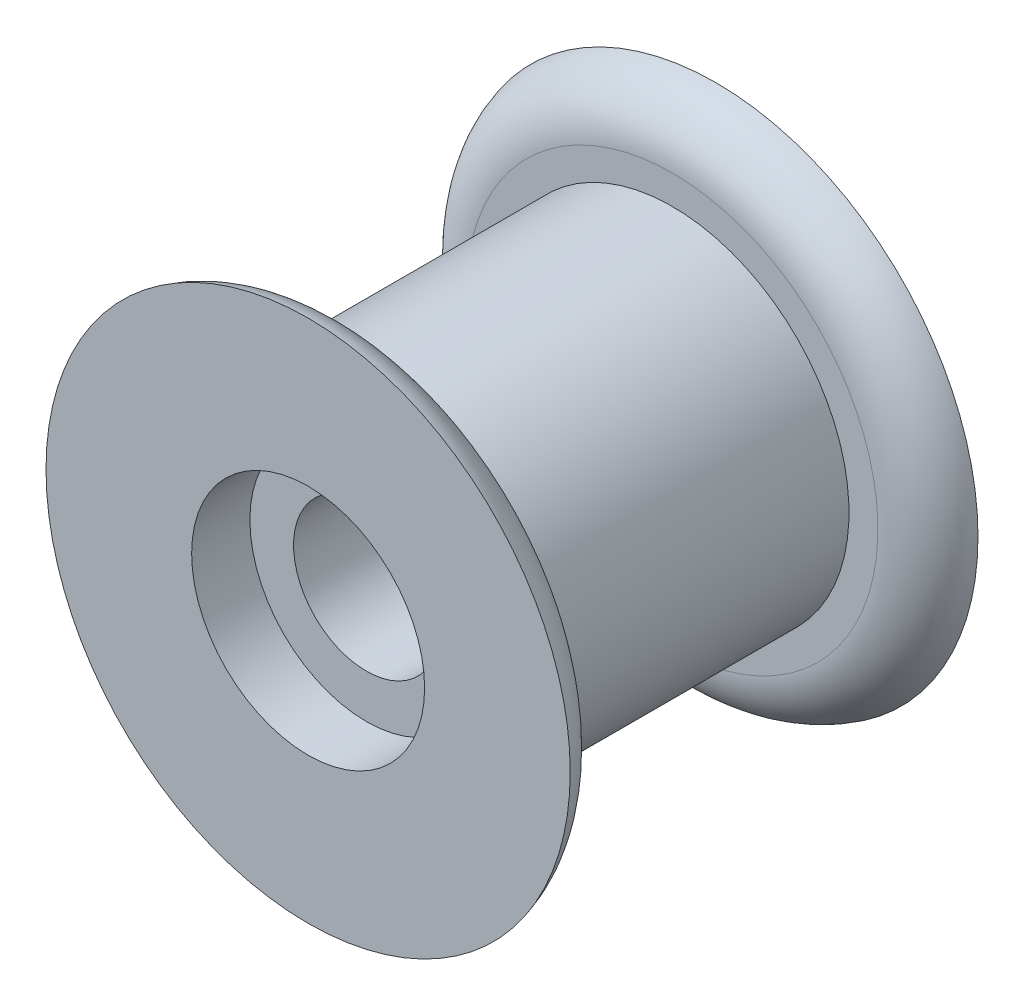
ISO-10303-21;
HEADER;
FILE_DESCRIPTION(('STEP AP214'),'2;1');
FILE_NAME('part.step','',(''),(''),'','','');
FILE_SCHEMA(('AUTOMOTIVE_DESIGN { 1 0 10303 214 1 1 1 1 }'));
ENDSEC;
DATA;
#1=APPLICATION_CONTEXT('core data for automotive mechanical design processes');
#2=APPLICATION_PROTOCOL_DEFINITION('international standard','automotive_design',2000,#1);
#3=PRODUCT_CONTEXT('',#1,'mechanical');
#4=PRODUCT('Part','Part','',(#3));
#5=PRODUCT_RELATED_PRODUCT_CATEGORY('part','',(#4));
#6=PRODUCT_DEFINITION_FORMATION('','',#4);
#7=PRODUCT_DEFINITION_CONTEXT('part definition',#1,'design');
#8=PRODUCT_DEFINITION('design','',#6,#7);
#9=PRODUCT_DEFINITION_SHAPE('','',#8);
#10=(LENGTH_UNIT() NAMED_UNIT(*) SI_UNIT(.MILLI.,.METRE.));
#11=(NAMED_UNIT(*) PLANE_ANGLE_UNIT() SI_UNIT($,.RADIAN.));
#12=(NAMED_UNIT(*) SI_UNIT($,.STERADIAN.) SOLID_ANGLE_UNIT());
#13=UNCERTAINTY_MEASURE_WITH_UNIT(LENGTH_MEASURE(1.E-05),#10,'distance_accuracy_value','');
#14=(GEOMETRIC_REPRESENTATION_CONTEXT(3) GLOBAL_UNCERTAINTY_ASSIGNED_CONTEXT((#13)) GLOBAL_UNIT_ASSIGNED_CONTEXT((#10,
#11,#12)) REPRESENTATION_CONTEXT('',''));
#15=CARTESIAN_POINT('',(0.,0.,0.));
#16=DIRECTION('',(0.,0.,1.));
#17=DIRECTION('',(1.,0.,0.));
#18=AXIS2_PLACEMENT_3D('',#15,#16,#17);
#19=CARTESIAN_POINT('',(0.,0.,0.));
#20=DIRECTION('',(0.,0.,1.));
#21=DIRECTION('',(1.,0.,0.));
#22=AXIS2_PLACEMENT_3D('',#19,#20,#21);
#23=PLANE('',#22);
#24=CARTESIAN_POINT('',(0.,0.,0.));
#25=DIRECTION('',(0.,0.,-1.));
#26=DIRECTION('',(-1.,0.,0.));
#27=AXIS2_PLACEMENT_3D('',#24,#25,#26);
#28=CIRCLE('',#27,4.);
#29=CARTESIAN_POINT('',(-4.,0.,0.));
#30=VERTEX_POINT('',#29);
#31=EDGE_CURVE('E60',#30,#30,#28,.T.);
#32=ORIENTED_EDGE('',*,*,#31,.F.);
#33=EDGE_LOOP('',(#32));
#34=FACE_BOUND('',#33,.T.);
#35=CARTESIAN_POINT('',(0.,0.,0.));
#36=DIRECTION('',(0.,0.,-1.));
#37=DIRECTION('',(-1.,0.,0.));
#38=AXIS2_PLACEMENT_3D('',#35,#36,#37);
#39=CIRCLE('',#38,9.);
#40=CARTESIAN_POINT('',(-9.,0.,0.));
#41=VERTEX_POINT('',#40);
#42=EDGE_CURVE('E44',#41,#41,#39,.T.);
#43=ORIENTED_EDGE('',*,*,#42,.T.);
#44=EDGE_LOOP('',(#43));
#45=FACE_BOUND('',#44,.T.);
#46=ADVANCED_FACE('F33',(#34,#45),#23,.F.);
#47=CARTESIAN_POINT('',(9.,0.,1.5));
#48=DIRECTION('',(0.,0.,-1.));
#49=DIRECTION('',(-1.,0.,0.));
#50=AXIS2_PLACEMENT_3D('',#47,#48,#49);
#51=PLANE('',#50);
#52=CARTESIAN_POINT('',(0.,0.,1.5));
#53=DIRECTION('',(0.,0.,-1.));
#54=DIRECTION('',(-1.,0.,0.));
#55=AXIS2_PLACEMENT_3D('',#52,#53,#54);
#56=CIRCLE('',#55,7.06350832689629);
#57=CARTESIAN_POINT('',(-7.06350832689629,0.,1.5));
#58=VERTEX_POINT('',#57);
#59=EDGE_CURVE('E10',#58,#58,#56,.F.);
#60=ORIENTED_EDGE('',*,*,#59,.T.);
#61=EDGE_LOOP('',(#60));
#62=FACE_BOUND('',#61,.T.);
#63=CARTESIAN_POINT('',(0.,0.,1.5));
#64=DIRECTION('',(0.,0.,-1.));
#65=DIRECTION('',(-1.,0.,0.));
#66=AXIS2_PLACEMENT_3D('',#63,#64,#65);
#67=CIRCLE('',#66,6.07);
#68=CARTESIAN_POINT('',(-6.07,0.,1.5));
#69=VERTEX_POINT('',#68);
#70=EDGE_CURVE('E48',#69,#69,#67,.T.);
#71=ORIENTED_EDGE('',*,*,#70,.T.);
#72=EDGE_LOOP('',(#71));
#73=FACE_BOUND('',#72,.T.);
#74=ADVANCED_FACE('F111',(#62,#73),#51,.F.);
#75=CARTESIAN_POINT('',(0.,0.,-9.94117647058824));
#76=DIRECTION('',(0.,0.,-1.));
#77=DIRECTION('',(-1.,0.,0.));
#78=AXIS2_PLACEMENT_3D('',#75,#76,#77);
#79=CYLINDRICAL_SURFACE('',#78,6.07);
#80=ORIENTED_EDGE('',*,*,#70,.F.);
#81=EDGE_LOOP('',(#80));
#82=FACE_BOUND('',#81,.T.);
#83=CARTESIAN_POINT('',(0.,0.,12.5));
#84=DIRECTION('',(0.,0.,-1.));
#85=DIRECTION('',(-1.,0.,0.));
#86=AXIS2_PLACEMENT_3D('',#83,#84,#85);
#87=CIRCLE('',#86,6.07);
#88=CARTESIAN_POINT('',(-6.07,0.,12.5));
#89=VERTEX_POINT('',#88);
#90=EDGE_CURVE('E53',#89,#89,#87,.T.);
#91=ORIENTED_EDGE('',*,*,#90,.T.);
#92=EDGE_LOOP('',(#91));
#93=FACE_BOUND('',#92,.T.);
#94=ADVANCED_FACE('F116',(#82,#93),#79,.T.);
#95=CARTESIAN_POINT('',(6.07,0.,12.5));
#96=DIRECTION('',(0.,0.,1.));
#97=DIRECTION('',(1.,0.,0.));
#98=AXIS2_PLACEMENT_3D('',#95,#96,#97);
#99=PLANE('',#98);
#100=CARTESIAN_POINT('',(0.,0.,12.5));
#101=DIRECTION('',(0.,0.,1.));
#102=DIRECTION('',(1.,0.,0.));
#103=AXIS2_PLACEMENT_3D('',#100,#101,#102);
#104=CIRCLE('',#103,7.06350832689625);
#105=CARTESIAN_POINT('',(7.06350832689625,0.,12.5));
#106=VERTEX_POINT('',#105);
#107=EDGE_CURVE('E40',#106,#106,#104,.F.);
#108=ORIENTED_EDGE('',*,*,#107,.T.);
#109=EDGE_LOOP('',(#108));
#110=FACE_BOUND('',#109,.T.);
#111=ORIENTED_EDGE('',*,*,#90,.F.);
#112=EDGE_LOOP('',(#111));
#113=FACE_BOUND('',#112,.T.);
#114=ADVANCED_FACE('F98',(#110,#113),#99,.F.);
#115=CARTESIAN_POINT('',(8.99999999999996,0.,14.));
#116=DIRECTION('',(0.,0.,-1.));
#117=DIRECTION('',(-1.,0.,0.));
#118=AXIS2_PLACEMENT_3D('',#115,#116,#117);
#119=PLANE('',#118);
#120=CARTESIAN_POINT('',(0.,0.,14.));
#121=DIRECTION('',(0.,0.,-1.));
#122=DIRECTION('',(-1.,0.,0.));
#123=AXIS2_PLACEMENT_3D('',#120,#121,#122);
#124=CIRCLE('',#123,4.);
#125=CARTESIAN_POINT('',(-4.,0.,14.));
#126=VERTEX_POINT('',#125);
#127=EDGE_CURVE('E66',#126,#126,#124,.T.);
#128=ORIENTED_EDGE('',*,*,#127,.T.);
#129=EDGE_LOOP('',(#128));
#130=FACE_BOUND('',#129,.T.);
#131=CARTESIAN_POINT('',(0.,0.,14.));
#132=DIRECTION('',(0.,0.,-1.));
#133=DIRECTION('',(-1.,0.,0.));
#134=AXIS2_PLACEMENT_3D('',#131,#132,#133);
#135=CIRCLE('',#134,8.99999999999996);
#136=CARTESIAN_POINT('',(-8.99999999999996,0.,14.));
#137=VERTEX_POINT('',#136);
#138=EDGE_CURVE('E56',#137,#137,#135,.T.);
#139=ORIENTED_EDGE('',*,*,#138,.F.);
#140=EDGE_LOOP('',(#139));
#141=FACE_BOUND('',#140,.T.);
#142=ADVANCED_FACE('F94',(#130,#141),#119,.F.);
#143=CARTESIAN_POINT('',(0.,0.,14.5));
#144=DIRECTION('',(0.,0.,-1.));
#145=DIRECTION('',(-1.,0.,0.));
#146=AXIS2_PLACEMENT_3D('',#143,#144,#145);
#147=TOROIDAL_SURFACE('',#146,7.06350832689625,2.);
#148=ORIENTED_EDGE('',*,*,#138,.T.);
#149=EDGE_LOOP('',(#148));
#150=FACE_BOUND('',#149,.T.);
#151=ORIENTED_EDGE('',*,*,#107,.F.);
#152=EDGE_LOOP('',(#151));
#153=FACE_BOUND('',#152,.T.);
#154=ADVANCED_FACE('F97',(#150,#153),#147,.T.);
#155=CARTESIAN_POINT('',(0.,0.,-0.5));
#156=DIRECTION('',(0.,0.,1.));
#157=DIRECTION('',(1.,0.,0.));
#158=AXIS2_PLACEMENT_3D('',#155,#156,#157);
#159=TOROIDAL_SURFACE('',#158,7.06350832689629,2.);
#160=ORIENTED_EDGE('',*,*,#59,.F.);
#161=EDGE_LOOP('',(#160));
#162=FACE_BOUND('',#161,.T.);
#163=ORIENTED_EDGE('',*,*,#42,.F.);
#164=EDGE_LOOP('',(#163));
#165=FACE_BOUND('',#164,.T.);
#166=ADVANCED_FACE('F35',(#162,#165),#159,.T.);
#167=CARTESIAN_POINT('',(0.,0.,2.));
#168=DIRECTION('',(0.,0.,-1.));
#169=DIRECTION('',(-1.,0.,0.));
#170=AXIS2_PLACEMENT_3D('',#167,#168,#169);
#171=CYLINDRICAL_SURFACE('',#170,4.);
#172=CARTESIAN_POINT('',(0.,0.,2.));
#173=DIRECTION('',(0.,0.,-1.));
#174=DIRECTION('',(-1.,0.,0.));
#175=AXIS2_PLACEMENT_3D('',#172,#173,#174);
#176=CIRCLE('',#175,4.);
#177=CARTESIAN_POINT('',(-4.,0.,2.));
#178=VERTEX_POINT('',#177);
#179=EDGE_CURVE('E59',#178,#178,#176,.T.);
#180=ORIENTED_EDGE('',*,*,#179,.F.);
#181=EDGE_LOOP('',(#180));
#182=FACE_BOUND('',#181,.T.);
#183=ORIENTED_EDGE('',*,*,#31,.T.);
#184=EDGE_LOOP('',(#183));
#185=FACE_BOUND('',#184,.T.);
#186=ADVANCED_FACE('F107',(#182,#185),#171,.F.);
#187=CARTESIAN_POINT('',(0.,0.,2.));
#188=DIRECTION('',(0.,0.,-1.));
#189=DIRECTION('',(-1.,0.,0.));
#190=AXIS2_PLACEMENT_3D('',#187,#188,#189);
#191=PLANE('',#190);
#192=CARTESIAN_POINT('',(0.,0.,2.));
#193=DIRECTION('',(0.,0.,-1.));
#194=DIRECTION('',(-1.,0.,0.));
#195=AXIS2_PLACEMENT_3D('',#192,#193,#194);
#196=CIRCLE('',#195,2.5);
#197=CARTESIAN_POINT('',(-2.5,0.,2.));
#198=VERTEX_POINT('',#197);
#199=EDGE_CURVE('E69',#198,#198,#196,.F.);
#200=ORIENTED_EDGE('',*,*,#199,.T.);
#201=EDGE_LOOP('',(#200));
#202=FACE_BOUND('',#201,.T.);
#203=ORIENTED_EDGE('',*,*,#179,.T.);
#204=EDGE_LOOP('',(#203));
#205=FACE_BOUND('',#204,.T.);
#206=ADVANCED_FACE('F90',(#202,#205),#191,.T.);
#207=CARTESIAN_POINT('',(0.,0.,12.));
#208=DIRECTION('',(0.,0.,1.));
#209=DIRECTION('',(1.,0.,0.));
#210=AXIS2_PLACEMENT_3D('',#207,#208,#209);
#211=CYLINDRICAL_SURFACE('',#210,4.);
#212=CARTESIAN_POINT('',(0.,0.,12.));
#213=DIRECTION('',(0.,0.,-1.));
#214=DIRECTION('',(-1.,0.,0.));
#215=AXIS2_PLACEMENT_3D('',#212,#213,#214);
#216=CIRCLE('',#215,4.);
#217=CARTESIAN_POINT('',(-4.,0.,12.));
#218=VERTEX_POINT('',#217);
#219=EDGE_CURVE('E63',#218,#218,#216,.T.);
#220=ORIENTED_EDGE('',*,*,#219,.T.);
#221=EDGE_LOOP('',(#220));
#222=FACE_BOUND('',#221,.T.);
#223=ORIENTED_EDGE('',*,*,#127,.F.);
#224=EDGE_LOOP('',(#223));
#225=FACE_BOUND('',#224,.T.);
#226=ADVANCED_FACE('F84',(#222,#225),#211,.F.);
#227=CARTESIAN_POINT('',(0.,0.,12.));
#228=DIRECTION('',(0.,0.,1.));
#229=DIRECTION('',(-1.,0.,0.));
#230=AXIS2_PLACEMENT_3D('',#227,#228,#229);
#231=PLANE('',#230);
#232=CARTESIAN_POINT('',(0.,0.,12.));
#233=DIRECTION('',(0.,0.,1.));
#234=DIRECTION('',(1.,0.,0.));
#235=AXIS2_PLACEMENT_3D('',#232,#233,#234);
#236=CIRCLE('',#235,2.5);
#237=CARTESIAN_POINT('',(2.5,0.,12.));
#238=VERTEX_POINT('',#237);
#239=EDGE_CURVE('E74',#238,#238,#236,.T.);
#240=ORIENTED_EDGE('',*,*,#239,.F.);
#241=EDGE_LOOP('',(#240));
#242=FACE_BOUND('',#241,.T.);
#243=ORIENTED_EDGE('',*,*,#219,.F.);
#244=EDGE_LOOP('',(#243));
#245=FACE_BOUND('',#244,.T.);
#246=ADVANCED_FACE('F81',(#242,#245),#231,.T.);
#247=CARTESIAN_POINT('',(0.,0.,-5.07106781186547));
#248=DIRECTION('',(0.,0.,1.));
#249=DIRECTION('',(1.,0.,0.));
#250=AXIS2_PLACEMENT_3D('',#247,#248,#249);
#251=CYLINDRICAL_SURFACE('',#250,2.5);
#252=ORIENTED_EDGE('',*,*,#239,.T.);
#253=EDGE_LOOP('',(#252));
#254=FACE_BOUND('',#253,.T.);
#255=ORIENTED_EDGE('',*,*,#199,.F.);
#256=EDGE_LOOP('',(#255));
#257=FACE_BOUND('',#256,.T.);
#258=ADVANCED_FACE('F78',(#254,#257),#251,.F.);
#259=CLOSED_SHELL('',(#46,#74,#94,#114,#142,#154,#166,#186,#206,#226,#246,#258));
#260=MANIFOLD_SOLID_BREP('B2',#259);
#261=ADVANCED_BREP_SHAPE_REPRESENTATION('',(#18,#260),#14);
#262=SHAPE_DEFINITION_REPRESENTATION(#9,#261);
ENDSEC;
END-ISO-10303-21;
